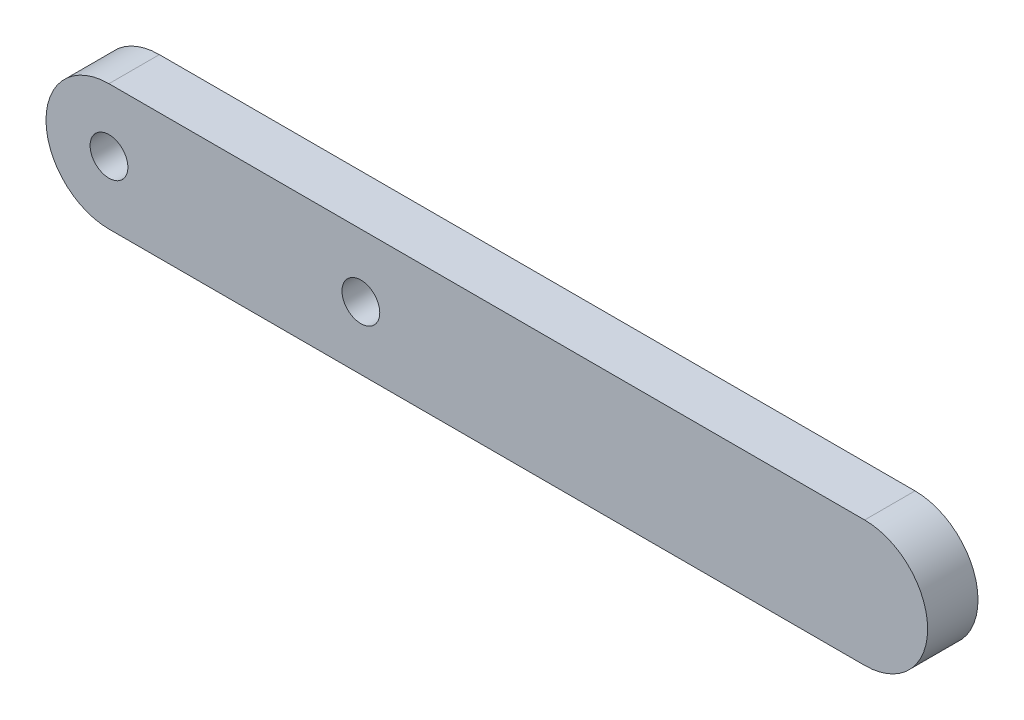
ISO-10303-21;
HEADER;
FILE_DESCRIPTION(('STEP AP214'),'2;1');
FILE_NAME('part.step','',(''),(''),'','','');
FILE_SCHEMA(('AUTOMOTIVE_DESIGN { 1 0 10303 214 1 1 1 1 }'));
ENDSEC;
DATA;
#1=APPLICATION_CONTEXT('core data for automotive mechanical design processes');
#2=APPLICATION_PROTOCOL_DEFINITION('international standard','automotive_design',2000,#1);
#3=PRODUCT_CONTEXT('',#1,'mechanical');
#4=PRODUCT('Part','Part','',(#3));
#5=PRODUCT_RELATED_PRODUCT_CATEGORY('part','',(#4));
#6=PRODUCT_DEFINITION_FORMATION('','',#4);
#7=PRODUCT_DEFINITION_CONTEXT('part definition',#1,'design');
#8=PRODUCT_DEFINITION('design','',#6,#7);
#9=PRODUCT_DEFINITION_SHAPE('','',#8);
#10=(LENGTH_UNIT() NAMED_UNIT(*) SI_UNIT(.MILLI.,.METRE.));
#11=(NAMED_UNIT(*) PLANE_ANGLE_UNIT() SI_UNIT($,.RADIAN.));
#12=(NAMED_UNIT(*) SI_UNIT($,.STERADIAN.) SOLID_ANGLE_UNIT());
#13=UNCERTAINTY_MEASURE_WITH_UNIT(LENGTH_MEASURE(1.E-05),#10,'distance_accuracy_value','');
#14=(GEOMETRIC_REPRESENTATION_CONTEXT(3) GLOBAL_UNCERTAINTY_ASSIGNED_CONTEXT((#13)) GLOBAL_UNIT_ASSIGNED_CONTEXT((#10,
#11,#12)) REPRESENTATION_CONTEXT('',''));
#15=CARTESIAN_POINT('',(0.,0.,0.));
#16=DIRECTION('',(0.,0.,1.));
#17=DIRECTION('',(1.,0.,0.));
#18=AXIS2_PLACEMENT_3D('',#15,#16,#17);
#19=CARTESIAN_POINT('',(-30.,0.,4.));
#20=DIRECTION('',(0.,0.,1.));
#21=DIRECTION('',(1.,0.,0.));
#22=AXIS2_PLACEMENT_3D('',#19,#20,#21);
#23=PLANE('',#22);
#24=CARTESIAN_POINT('',(-30.,0.,4.));
#25=DIRECTION('',(0.,0.,1.));
#26=DIRECTION('',(1.,0.,0.));
#27=AXIS2_PLACEMENT_3D('',#24,#25,#26);
#28=CIRCLE('',#27,1.5);
#29=CARTESIAN_POINT('',(-28.5,0.,4.));
#30=VERTEX_POINT('',#29);
#31=EDGE_CURVE('E100',#30,#30,#28,.T.);
#32=ORIENTED_EDGE('',*,*,#31,.F.);
#33=EDGE_LOOP('',(#32));
#34=FACE_BOUND('',#33,.T.);
#35=CARTESIAN_POINT('',(-30.,0.,4.));
#36=DIRECTION('',(0.,0.,1.));
#37=DIRECTION('',(1.,0.,0.));
#38=AXIS2_PLACEMENT_3D('',#35,#36,#37);
#39=CIRCLE('',#38,5.);
#40=CARTESIAN_POINT('',(-30.,5.,4.));
#41=VERTEX_POINT('',#40);
#42=CARTESIAN_POINT('',(-30.,-5.,4.));
#43=VERTEX_POINT('',#42);
#44=EDGE_CURVE('E85',#41,#43,#39,.T.);
#45=ORIENTED_EDGE('',*,*,#44,.T.);
#46=DIRECTION('',(1.,0.,0.));
#47=VECTOR('',#46,1.);
#48=CARTESIAN_POINT('',(-30.,-5.,4.));
#49=LINE('',#48,#47);
#50=CARTESIAN_POINT('',(30.,-4.99999999999999,4.));
#51=VERTEX_POINT('',#50);
#52=EDGE_CURVE('E80',#43,#51,#49,.T.);
#53=ORIENTED_EDGE('',*,*,#52,.T.);
#54=CARTESIAN_POINT('',(30.,0.,4.));
#55=DIRECTION('',(0.,0.,1.));
#56=DIRECTION('',(1.,0.,0.));
#57=AXIS2_PLACEMENT_3D('',#54,#55,#56);
#58=CIRCLE('',#57,5.);
#59=CARTESIAN_POINT('',(30.,5.00000000000001,4.));
#60=VERTEX_POINT('',#59);
#61=EDGE_CURVE('E83',#51,#60,#58,.T.);
#62=ORIENTED_EDGE('',*,*,#61,.T.);
#63=DIRECTION('',(-1.,0.,0.));
#64=VECTOR('',#63,1.);
#65=CARTESIAN_POINT('',(-30.,5.,4.));
#66=LINE('',#65,#64);
#67=EDGE_CURVE('E50',#60,#41,#66,.T.);
#68=ORIENTED_EDGE('',*,*,#67,.T.);
#69=EDGE_LOOP('',(#45,#53,#62,#68));
#70=FACE_BOUND('',#69,.T.);
#71=CARTESIAN_POINT('',(-10.,0.,4.));
#72=DIRECTION('',(0.,0.,1.));
#73=DIRECTION('',(1.,0.,0.));
#74=AXIS2_PLACEMENT_3D('',#71,#72,#73);
#75=CIRCLE('',#74,1.5);
#76=CARTESIAN_POINT('',(-8.5,0.,4.));
#77=VERTEX_POINT('',#76);
#78=EDGE_CURVE('E115',#77,#77,#75,.T.);
#79=ORIENTED_EDGE('',*,*,#78,.F.);
#80=EDGE_LOOP('',(#79));
#81=FACE_BOUND('',#80,.T.);
#82=ADVANCED_FACE('F33',(#34,#70,#81),#23,.T.);
#83=CARTESIAN_POINT('',(-30.,0.,0.));
#84=DIRECTION('',(0.,0.,1.));
#85=DIRECTION('',(1.,0.,0.));
#86=AXIS2_PLACEMENT_3D('',#83,#84,#85);
#87=PLANE('',#86);
#88=CARTESIAN_POINT('',(-30.,0.,0.));
#89=DIRECTION('',(0.,0.,1.));
#90=DIRECTION('',(1.,0.,0.));
#91=AXIS2_PLACEMENT_3D('',#88,#89,#90);
#92=CIRCLE('',#91,5.);
#93=CARTESIAN_POINT('',(-30.,5.,0.));
#94=VERTEX_POINT('',#93);
#95=CARTESIAN_POINT('',(-30.,-5.,0.));
#96=VERTEX_POINT('',#95);
#97=EDGE_CURVE('E97',#94,#96,#92,.T.);
#98=ORIENTED_EDGE('',*,*,#97,.F.);
#99=DIRECTION('',(-1.,0.,0.));
#100=VECTOR('',#99,1.);
#101=CARTESIAN_POINT('',(-30.,5.,0.));
#102=LINE('',#101,#100);
#103=CARTESIAN_POINT('',(30.,5.00000000000001,0.));
#104=VERTEX_POINT('',#103);
#105=EDGE_CURVE('E73',#104,#94,#102,.T.);
#106=ORIENTED_EDGE('',*,*,#105,.F.);
#107=CARTESIAN_POINT('',(30.,0.,0.));
#108=DIRECTION('',(0.,0.,1.));
#109=DIRECTION('',(1.,0.,0.));
#110=AXIS2_PLACEMENT_3D('',#107,#108,#109);
#111=CIRCLE('',#110,5.);
#112=CARTESIAN_POINT('',(30.,-4.99999999999999,0.));
#113=VERTEX_POINT('',#112);
#114=EDGE_CURVE('E67',#113,#104,#111,.T.);
#115=ORIENTED_EDGE('',*,*,#114,.F.);
#116=DIRECTION('',(1.,0.,0.));
#117=VECTOR('',#116,1.);
#118=CARTESIAN_POINT('',(-30.,-5.,0.));
#119=LINE('',#118,#117);
#120=EDGE_CURVE('E89',#96,#113,#119,.T.);
#121=ORIENTED_EDGE('',*,*,#120,.F.);
#122=EDGE_LOOP('',(#98,#106,#115,#121));
#123=FACE_BOUND('',#122,.T.);
#124=CARTESIAN_POINT('',(-30.,0.,0.));
#125=DIRECTION('',(0.,0.,1.));
#126=DIRECTION('',(1.,0.,0.));
#127=AXIS2_PLACEMENT_3D('',#124,#125,#126);
#128=CIRCLE('',#127,1.5);
#129=CARTESIAN_POINT('',(-28.5,0.,0.));
#130=VERTEX_POINT('',#129);
#131=EDGE_CURVE('E112',#130,#130,#128,.T.);
#132=ORIENTED_EDGE('',*,*,#131,.T.);
#133=EDGE_LOOP('',(#132));
#134=FACE_BOUND('',#133,.T.);
#135=CARTESIAN_POINT('',(-10.,0.,0.));
#136=DIRECTION('',(0.,0.,1.));
#137=DIRECTION('',(1.,0.,0.));
#138=AXIS2_PLACEMENT_3D('',#135,#136,#137);
#139=CIRCLE('',#138,1.5);
#140=CARTESIAN_POINT('',(-8.5,0.,0.));
#141=VERTEX_POINT('',#140);
#142=EDGE_CURVE('E118',#141,#141,#139,.T.);
#143=ORIENTED_EDGE('',*,*,#142,.T.);
#144=EDGE_LOOP('',(#143));
#145=FACE_BOUND('',#144,.T.);
#146=ADVANCED_FACE('F108',(#123,#134,#145),#87,.F.);
#147=CARTESIAN_POINT('',(-30.,0.,4.));
#148=DIRECTION('',(0.,0.,-1.));
#149=DIRECTION('',(-1.,0.,0.));
#150=AXIS2_PLACEMENT_3D('',#147,#148,#149);
#151=CYLINDRICAL_SURFACE('',#150,5.);
#152=ORIENTED_EDGE('',*,*,#97,.T.);
#153=DIRECTION('',(0.,0.,-1.));
#154=VECTOR('',#153,1.);
#155=CARTESIAN_POINT('',(-30.,-5.,4.));
#156=LINE('',#155,#154);
#157=EDGE_CURVE('E11',#43,#96,#156,.T.);
#158=ORIENTED_EDGE('',*,*,#157,.F.);
#159=ORIENTED_EDGE('',*,*,#44,.F.);
#160=DIRECTION('',(0.,0.,-1.));
#161=VECTOR('',#160,1.);
#162=CARTESIAN_POINT('',(-30.,5.,4.));
#163=LINE('',#162,#161);
#164=EDGE_CURVE('E93',#41,#94,#163,.T.);
#165=ORIENTED_EDGE('',*,*,#164,.T.);
#166=EDGE_LOOP('',(#152,#158,#159,#165));
#167=FACE_BOUND('',#166,.T.);
#168=ADVANCED_FACE('F35',(#167),#151,.T.);
#169=CARTESIAN_POINT('',(-30.,-5.,4.));
#170=DIRECTION('',(0.,1.,0.));
#171=DIRECTION('',(-1.,0.,0.));
#172=AXIS2_PLACEMENT_3D('',#169,#170,#171);
#173=PLANE('',#172);
#174=ORIENTED_EDGE('',*,*,#120,.T.);
#175=DIRECTION('',(0.,0.,-1.));
#176=VECTOR('',#175,1.);
#177=CARTESIAN_POINT('',(30.,-4.99999999999999,4.));
#178=LINE('',#177,#176);
#179=EDGE_CURVE('E42',#51,#113,#178,.T.);
#180=ORIENTED_EDGE('',*,*,#179,.F.);
#181=ORIENTED_EDGE('',*,*,#52,.F.);
#182=ORIENTED_EDGE('',*,*,#157,.T.);
#183=EDGE_LOOP('',(#174,#180,#181,#182));
#184=FACE_BOUND('',#183,.T.);
#185=ADVANCED_FACE('F88',(#184),#173,.F.);
#186=CARTESIAN_POINT('',(30.,0.,4.));
#187=DIRECTION('',(0.,0.,-1.));
#188=DIRECTION('',(-1.,0.,0.));
#189=AXIS2_PLACEMENT_3D('',#186,#187,#188);
#190=CYLINDRICAL_SURFACE('',#189,5.);
#191=ORIENTED_EDGE('',*,*,#114,.T.);
#192=DIRECTION('',(0.,0.,-1.));
#193=VECTOR('',#192,1.);
#194=CARTESIAN_POINT('',(30.,5.00000000000001,4.));
#195=LINE('',#194,#193);
#196=EDGE_CURVE('E90',#60,#104,#195,.T.);
#197=ORIENTED_EDGE('',*,*,#196,.F.);
#198=ORIENTED_EDGE('',*,*,#61,.F.);
#199=ORIENTED_EDGE('',*,*,#179,.T.);
#200=EDGE_LOOP('',(#191,#197,#198,#199));
#201=FACE_BOUND('',#200,.T.);
#202=ADVANCED_FACE('F91',(#201),#190,.T.);
#203=CARTESIAN_POINT('',(-30.,5.,4.));
#204=DIRECTION('',(0.,-1.,0.));
#205=DIRECTION('',(1.,0.,0.));
#206=AXIS2_PLACEMENT_3D('',#203,#204,#205);
#207=PLANE('',#206);
#208=ORIENTED_EDGE('',*,*,#105,.T.);
#209=ORIENTED_EDGE('',*,*,#164,.F.);
#210=ORIENTED_EDGE('',*,*,#67,.F.);
#211=ORIENTED_EDGE('',*,*,#196,.T.);
#212=EDGE_LOOP('',(#208,#209,#210,#211));
#213=FACE_BOUND('',#212,.T.);
#214=ADVANCED_FACE('F105',(#213),#207,.F.);
#215=CARTESIAN_POINT('',(-30.,0.,4.));
#216=DIRECTION('',(0.,0.,-1.));
#217=DIRECTION('',(-1.,0.,0.));
#218=AXIS2_PLACEMENT_3D('',#215,#216,#217);
#219=CYLINDRICAL_SURFACE('',#218,1.5);
#220=ORIENTED_EDGE('',*,*,#31,.T.);
#221=EDGE_LOOP('',(#220));
#222=FACE_BOUND('',#221,.T.);
#223=ORIENTED_EDGE('',*,*,#131,.F.);
#224=EDGE_LOOP('',(#223));
#225=FACE_BOUND('',#224,.T.);
#226=ADVANCED_FACE('F135',(#222,#225),#219,.F.);
#227=CARTESIAN_POINT('',(-10.,0.,4.));
#228=DIRECTION('',(0.,0.,-1.));
#229=DIRECTION('',(-1.,0.,0.));
#230=AXIS2_PLACEMENT_3D('',#227,#228,#229);
#231=CYLINDRICAL_SURFACE('',#230,1.5);
#232=ORIENTED_EDGE('',*,*,#78,.T.);
#233=EDGE_LOOP('',(#232));
#234=FACE_BOUND('',#233,.T.);
#235=ORIENTED_EDGE('',*,*,#142,.F.);
#236=EDGE_LOOP('',(#235));
#237=FACE_BOUND('',#236,.T.);
#238=ADVANCED_FACE('F124',(#234,#237),#231,.F.);
#239=CLOSED_SHELL('',(#82,#146,#168,#185,#202,#214,#226,#238));
#240=MANIFOLD_SOLID_BREP('B2',#239);
#241=ADVANCED_BREP_SHAPE_REPRESENTATION('',(#18,#240),#14);
#242=SHAPE_DEFINITION_REPRESENTATION(#9,#241);
ENDSEC;
END-ISO-10303-21;
